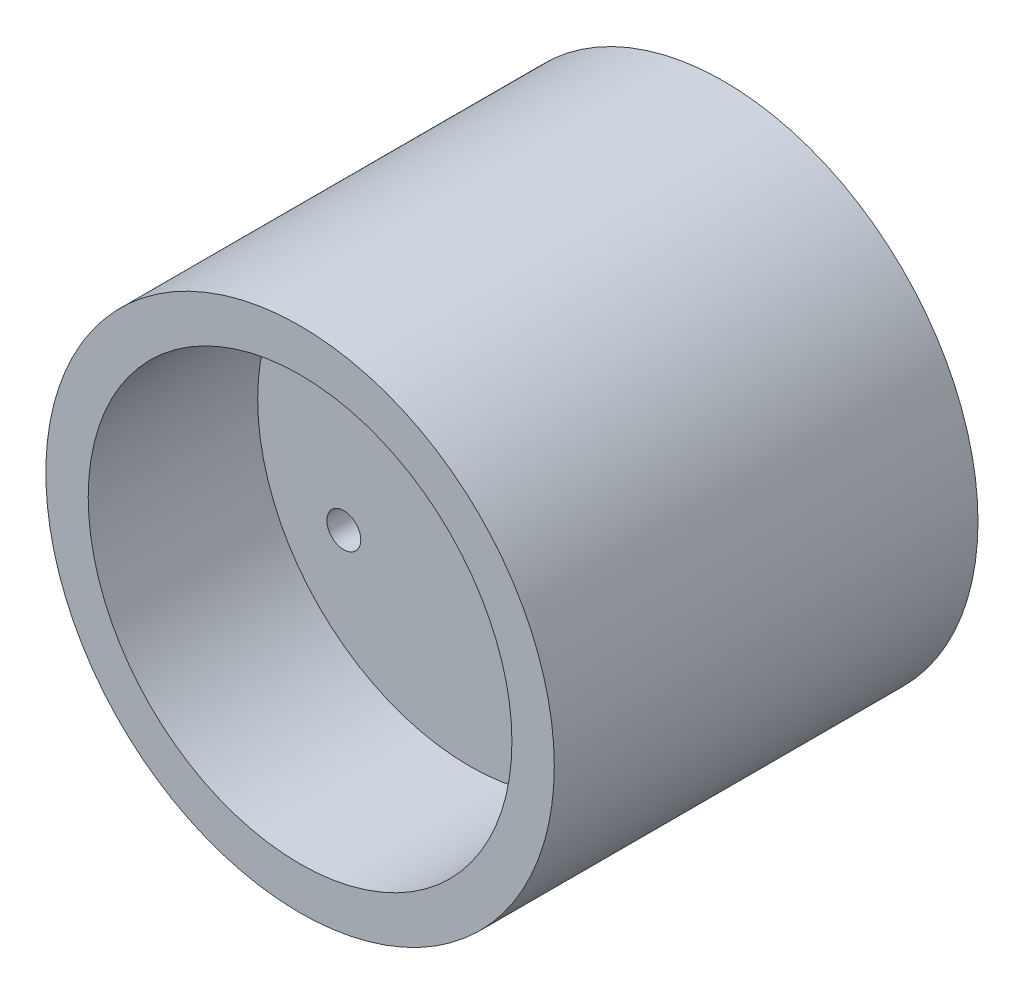
ISO-10303-21;
HEADER;
FILE_DESCRIPTION(('STEP AP214'),'2;1');
FILE_NAME('part.step','',(''),(''),'','','');
FILE_SCHEMA(('AUTOMOTIVE_DESIGN { 1 0 10303 214 1 1 1 1 }'));
ENDSEC;
DATA;
#1=APPLICATION_CONTEXT('core data for automotive mechanical design processes');
#2=APPLICATION_PROTOCOL_DEFINITION('international standard','automotive_design',2000,#1);
#3=PRODUCT_CONTEXT('',#1,'mechanical');
#4=PRODUCT('Part','Part','',(#3));
#5=PRODUCT_RELATED_PRODUCT_CATEGORY('part','',(#4));
#6=PRODUCT_DEFINITION_FORMATION('','',#4);
#7=PRODUCT_DEFINITION_CONTEXT('part definition',#1,'design');
#8=PRODUCT_DEFINITION('design','',#6,#7);
#9=PRODUCT_DEFINITION_SHAPE('','',#8);
#10=(LENGTH_UNIT() NAMED_UNIT(*) SI_UNIT(.MILLI.,.METRE.));
#11=(NAMED_UNIT(*) PLANE_ANGLE_UNIT() SI_UNIT($,.RADIAN.));
#12=(NAMED_UNIT(*) SI_UNIT($,.STERADIAN.) SOLID_ANGLE_UNIT());
#13=UNCERTAINTY_MEASURE_WITH_UNIT(LENGTH_MEASURE(1.E-05),#10,'distance_accuracy_value','');
#14=(GEOMETRIC_REPRESENTATION_CONTEXT(3) GLOBAL_UNCERTAINTY_ASSIGNED_CONTEXT((#13)) GLOBAL_UNIT_ASSIGNED_CONTEXT((#10,
#11,#12)) REPRESENTATION_CONTEXT('',''));
#15=CARTESIAN_POINT('',(0.,0.,0.));
#16=DIRECTION('',(0.,0.,1.));
#17=DIRECTION('',(1.,0.,0.));
#18=AXIS2_PLACEMENT_3D('',#15,#16,#17);
#19=CARTESIAN_POINT('',(-8.14878730255872,-1.55409745293467,37.5));
#20=DIRECTION('',(0.,0.,-1.));
#21=DIRECTION('',(-1.,0.,0.));
#22=AXIS2_PLACEMENT_3D('',#19,#20,#21);
#23=CYLINDRICAL_SURFACE('',#22,15.);
#24=CARTESIAN_POINT('',(-8.14878730255872,-1.55409745293467,37.5));
#25=DIRECTION('',(0.,0.,1.));
#26=DIRECTION('',(1.,0.,0.));
#27=AXIS2_PLACEMENT_3D('',#24,#25,#26);
#28=CIRCLE('',#27,15.);
#29=CARTESIAN_POINT('',(6.85121269744128,-1.55409745293467,37.5));
#30=VERTEX_POINT('',#29);
#31=EDGE_CURVE('E12',#30,#30,#28,.T.);
#32=ORIENTED_EDGE('',*,*,#31,.F.);
#33=EDGE_LOOP('',(#32));
#34=FACE_BOUND('',#33,.T.);
#35=CARTESIAN_POINT('',(-8.14878730255872,-1.55409745293467,12.5));
#36=DIRECTION('',(0.,0.,1.));
#37=DIRECTION('',(1.,0.,0.));
#38=AXIS2_PLACEMENT_3D('',#35,#36,#37);
#39=CIRCLE('',#38,15.);
#40=CARTESIAN_POINT('',(6.85121269744128,-1.55409745293467,12.5));
#41=VERTEX_POINT('',#40);
#42=EDGE_CURVE('E49',#41,#41,#39,.T.);
#43=ORIENTED_EDGE('',*,*,#42,.T.);
#44=EDGE_LOOP('',(#43));
#45=FACE_BOUND('',#44,.T.);
#46=ADVANCED_FACE('F46',(#34,#45),#23,.T.);
#47=CARTESIAN_POINT('',(-8.14878730255872,-1.55409745293467,37.5));
#48=DIRECTION('',(0.,0.,1.));
#49=DIRECTION('',(1.,0.,0.));
#50=AXIS2_PLACEMENT_3D('',#47,#48,#49);
#51=PLANE('',#50);
#52=CARTESIAN_POINT('',(-8.14878730255872,-1.55409745293467,37.5));
#53=DIRECTION('',(0.,0.,1.));
#54=DIRECTION('',(1.,0.,0.));
#55=AXIS2_PLACEMENT_3D('',#52,#53,#54);
#56=CIRCLE('',#55,12.5);
#57=CARTESIAN_POINT('',(4.35121269744128,-1.55409745293467,37.5));
#58=VERTEX_POINT('',#57);
#59=EDGE_CURVE('E64',#58,#58,#56,.T.);
#60=ORIENTED_EDGE('',*,*,#59,.F.);
#61=EDGE_LOOP('',(#60));
#62=FACE_BOUND('',#61,.T.);
#63=ORIENTED_EDGE('',*,*,#31,.T.);
#64=EDGE_LOOP('',(#63));
#65=FACE_BOUND('',#64,.T.);
#66=ADVANCED_FACE('F111',(#62,#65),#51,.T.);
#67=CARTESIAN_POINT('',(-8.14878730255872,-1.55409745293467,12.5));
#68=DIRECTION('',(0.,0.,1.));
#69=DIRECTION('',(1.,0.,0.));
#70=AXIS2_PLACEMENT_3D('',#67,#68,#69);
#71=PLANE('',#70);
#72=CARTESIAN_POINT('',(-8.14878730255872,-1.55409745293467,12.5));
#73=DIRECTION('',(0.,0.,-1.));
#74=DIRECTION('',(-1.,0.,0.));
#75=AXIS2_PLACEMENT_3D('',#72,#73,#74);
#76=CIRCLE('',#75,12.5);
#77=CARTESIAN_POINT('',(-20.6487873025587,-1.55409745293467,12.5));
#78=VERTEX_POINT('',#77);
#79=EDGE_CURVE('E58',#78,#78,#76,.T.);
#80=ORIENTED_EDGE('',*,*,#79,.F.);
#81=EDGE_LOOP('',(#80));
#82=FACE_BOUND('',#81,.T.);
#83=ORIENTED_EDGE('',*,*,#42,.F.);
#84=EDGE_LOOP('',(#83));
#85=FACE_BOUND('',#84,.T.);
#86=ADVANCED_FACE('F105',(#82,#85),#71,.F.);
#87=CARTESIAN_POINT('',(-8.14878730255872,-1.55409745293467,17.5));
#88=DIRECTION('',(0.,0.,-1.));
#89=DIRECTION('',(-1.,0.,0.));
#90=AXIS2_PLACEMENT_3D('',#87,#88,#89);
#91=CYLINDRICAL_SURFACE('',#90,12.5);
#92=CARTESIAN_POINT('',(-8.14878730255872,-1.55409745293467,17.5));
#93=DIRECTION('',(0.,0.,-1.));
#94=DIRECTION('',(-1.,0.,0.));
#95=AXIS2_PLACEMENT_3D('',#92,#93,#94);
#96=CIRCLE('',#95,12.5);
#97=CARTESIAN_POINT('',(-20.6487873025587,-1.55409745293467,17.5));
#98=VERTEX_POINT('',#97);
#99=EDGE_CURVE('E56',#98,#98,#96,.T.);
#100=ORIENTED_EDGE('',*,*,#99,.F.);
#101=EDGE_LOOP('',(#100));
#102=FACE_BOUND('',#101,.T.);
#103=ORIENTED_EDGE('',*,*,#79,.T.);
#104=EDGE_LOOP('',(#103));
#105=FACE_BOUND('',#104,.T.);
#106=ADVANCED_FACE('F95',(#102,#105),#91,.F.);
#107=CARTESIAN_POINT('',(-8.14878730255872,-1.55409745293467,17.5));
#108=DIRECTION('',(0.,0.,-1.));
#109=DIRECTION('',(-1.,0.,0.));
#110=AXIS2_PLACEMENT_3D('',#107,#108,#109);
#111=PLANE('',#110);
#112=CARTESIAN_POINT('',(-15.5665181240553,-5.70621079323264,17.5));
#113=DIRECTION('',(0.,0.,-1.));
#114=DIRECTION('',(-1.,0.,0.));
#115=AXIS2_PLACEMENT_3D('',#112,#113,#114);
#116=CIRCLE('',#115,1.);
#117=CARTESIAN_POINT('',(-16.5665181240553,-5.70621079323264,17.5));
#118=VERTEX_POINT('',#117);
#119=EDGE_CURVE('E80',#118,#118,#116,.T.);
#120=ORIENTED_EDGE('',*,*,#119,.F.);
#121=EDGE_LOOP('',(#120));
#122=FACE_BOUND('',#121,.T.);
#123=CARTESIAN_POINT('',(-0.844086259719823,-5.90198411263675,17.5));
#124=DIRECTION('',(0.,0.,-1.));
#125=DIRECTION('',(-1.,0.,0.));
#126=AXIS2_PLACEMENT_3D('',#123,#124,#125);
#127=CIRCLE('',#126,1.);
#128=CARTESIAN_POINT('',(-1.84408625971982,-5.90198411263675,17.5));
#129=VERTEX_POINT('',#128);
#130=EDGE_CURVE('E73',#129,#129,#127,.T.);
#131=ORIENTED_EDGE('',*,*,#130,.F.);
#132=EDGE_LOOP('',(#131));
#133=FACE_BOUND('',#132,.T.);
#134=CARTESIAN_POINT('',(-8.03575752390039,6.94590254706534,17.5));
#135=DIRECTION('',(0.,0.,-1.));
#136=DIRECTION('',(-1.,0.,0.));
#137=AXIS2_PLACEMENT_3D('',#134,#135,#136);
#138=CIRCLE('',#137,1.);
#139=CARTESIAN_POINT('',(-9.03575752390039,6.94590254706534,17.5));
#140=VERTEX_POINT('',#139);
#141=EDGE_CURVE('E74',#140,#140,#138,.T.);
#142=ORIENTED_EDGE('',*,*,#141,.F.);
#143=EDGE_LOOP('',(#142));
#144=FACE_BOUND('',#143,.T.);
#145=ORIENTED_EDGE('',*,*,#99,.T.);
#146=EDGE_LOOP('',(#145));
#147=FACE_BOUND('',#146,.T.);
#148=ADVANCED_FACE('F91',(#122,#133,#144,#147),#111,.T.);
#149=CARTESIAN_POINT('',(-8.14878730255872,-1.55409745293467,27.5));
#150=DIRECTION('',(0.,0.,1.));
#151=DIRECTION('',(1.,0.,0.));
#152=AXIS2_PLACEMENT_3D('',#149,#150,#151);
#153=CYLINDRICAL_SURFACE('',#152,12.5);
#154=CARTESIAN_POINT('',(-8.14878730255872,-1.55409745293467,27.5));
#155=DIRECTION('',(0.,0.,1.));
#156=DIRECTION('',(1.,0.,0.));
#157=AXIS2_PLACEMENT_3D('',#154,#155,#156);
#158=CIRCLE('',#157,12.5);
#159=CARTESIAN_POINT('',(4.35121269744128,-1.55409745293467,27.5));
#160=VERTEX_POINT('',#159);
#161=EDGE_CURVE('E61',#160,#160,#158,.T.);
#162=ORIENTED_EDGE('',*,*,#161,.F.);
#163=EDGE_LOOP('',(#162));
#164=FACE_BOUND('',#163,.T.);
#165=ORIENTED_EDGE('',*,*,#59,.T.);
#166=EDGE_LOOP('',(#165));
#167=FACE_BOUND('',#166,.T.);
#168=ADVANCED_FACE('F94',(#164,#167),#153,.F.);
#169=CARTESIAN_POINT('',(-8.14878730255872,-1.55409745293467,27.5));
#170=DIRECTION('',(0.,0.,1.));
#171=DIRECTION('',(1.,0.,0.));
#172=AXIS2_PLACEMENT_3D('',#169,#170,#171);
#173=PLANE('',#172);
#174=CARTESIAN_POINT('',(-15.5665181240553,-5.70621079323264,27.5));
#175=DIRECTION('',(0.,0.,1.));
#176=DIRECTION('',(1.,0.,0.));
#177=AXIS2_PLACEMENT_3D('',#174,#175,#176);
#178=CIRCLE('',#177,1.);
#179=CARTESIAN_POINT('',(-14.5665181240553,-5.70621079323264,27.5));
#180=VERTEX_POINT('',#179);
#181=EDGE_CURVE('E67',#180,#180,#178,.F.);
#182=ORIENTED_EDGE('',*,*,#181,.T.);
#183=EDGE_LOOP('',(#182));
#184=FACE_BOUND('',#183,.T.);
#185=CARTESIAN_POINT('',(-0.844086259719823,-5.90198411263675,27.5));
#186=DIRECTION('',(0.,0.,1.));
#187=DIRECTION('',(1.,0.,0.));
#188=AXIS2_PLACEMENT_3D('',#185,#186,#187);
#189=CIRCLE('',#188,1.);
#190=CARTESIAN_POINT('',(0.155913740280178,-5.90198411263675,27.5));
#191=VERTEX_POINT('',#190);
#192=EDGE_CURVE('E77',#191,#191,#189,.F.);
#193=ORIENTED_EDGE('',*,*,#192,.T.);
#194=EDGE_LOOP('',(#193));
#195=FACE_BOUND('',#194,.T.);
#196=CARTESIAN_POINT('',(-8.03575752390039,6.94590254706534,27.5));
#197=DIRECTION('',(0.,0.,1.));
#198=DIRECTION('',(1.,0.,0.));
#199=AXIS2_PLACEMENT_3D('',#196,#197,#198);
#200=CIRCLE('',#199,1.);
#201=CARTESIAN_POINT('',(-7.03575752390038,6.94590254706534,27.5));
#202=VERTEX_POINT('',#201);
#203=EDGE_CURVE('E70',#202,#202,#200,.F.);
#204=ORIENTED_EDGE('',*,*,#203,.T.);
#205=EDGE_LOOP('',(#204));
#206=FACE_BOUND('',#205,.T.);
#207=ORIENTED_EDGE('',*,*,#161,.T.);
#208=EDGE_LOOP('',(#207));
#209=FACE_BOUND('',#208,.T.);
#210=ADVANCED_FACE('F127',(#184,#195,#206,#209),#173,.T.);
#211=CARTESIAN_POINT('',(-8.03575752390039,6.94590254706534,30.3284271247462));
#212=DIRECTION('',(0.,0.,-1.));
#213=DIRECTION('',(-1.,0.,0.));
#214=AXIS2_PLACEMENT_3D('',#211,#212,#213);
#215=CYLINDRICAL_SURFACE('',#214,1.);
#216=ORIENTED_EDGE('',*,*,#141,.T.);
#217=EDGE_LOOP('',(#216));
#218=FACE_BOUND('',#217,.T.);
#219=ORIENTED_EDGE('',*,*,#203,.F.);
#220=EDGE_LOOP('',(#219));
#221=FACE_BOUND('',#220,.T.);
#222=ADVANCED_FACE('F131',(#218,#221),#215,.F.);
#223=CARTESIAN_POINT('',(-0.844086259719823,-5.90198411263675,30.3284271247462));
#224=DIRECTION('',(0.,0.,-1.));
#225=DIRECTION('',(-1.,0.,0.));
#226=AXIS2_PLACEMENT_3D('',#223,#224,#225);
#227=CYLINDRICAL_SURFACE('',#226,1.);
#228=ORIENTED_EDGE('',*,*,#130,.T.);
#229=EDGE_LOOP('',(#228));
#230=FACE_BOUND('',#229,.T.);
#231=ORIENTED_EDGE('',*,*,#192,.F.);
#232=EDGE_LOOP('',(#231));
#233=FACE_BOUND('',#232,.T.);
#234=ADVANCED_FACE('F135',(#230,#233),#227,.F.);
#235=CARTESIAN_POINT('',(-15.5665181240553,-5.70621079323264,30.3284271247462));
#236=DIRECTION('',(0.,0.,-1.));
#237=DIRECTION('',(-1.,0.,0.));
#238=AXIS2_PLACEMENT_3D('',#235,#236,#237);
#239=CYLINDRICAL_SURFACE('',#238,1.);
#240=ORIENTED_EDGE('',*,*,#119,.T.);
#241=EDGE_LOOP('',(#240));
#242=FACE_BOUND('',#241,.T.);
#243=ORIENTED_EDGE('',*,*,#181,.F.);
#244=EDGE_LOOP('',(#243));
#245=FACE_BOUND('',#244,.T.);
#246=ADVANCED_FACE('F88',(#242,#245),#239,.F.);
#247=CLOSED_SHELL('',(#46,#66,#86,#106,#148,#168,#210,#222,#234,#246));
#248=MANIFOLD_SOLID_BREP('B2',#247);
#249=ADVANCED_BREP_SHAPE_REPRESENTATION('',(#18,#248),#14);
#250=SHAPE_DEFINITION_REPRESENTATION(#9,#249);
ENDSEC;
END-ISO-10303-21;
